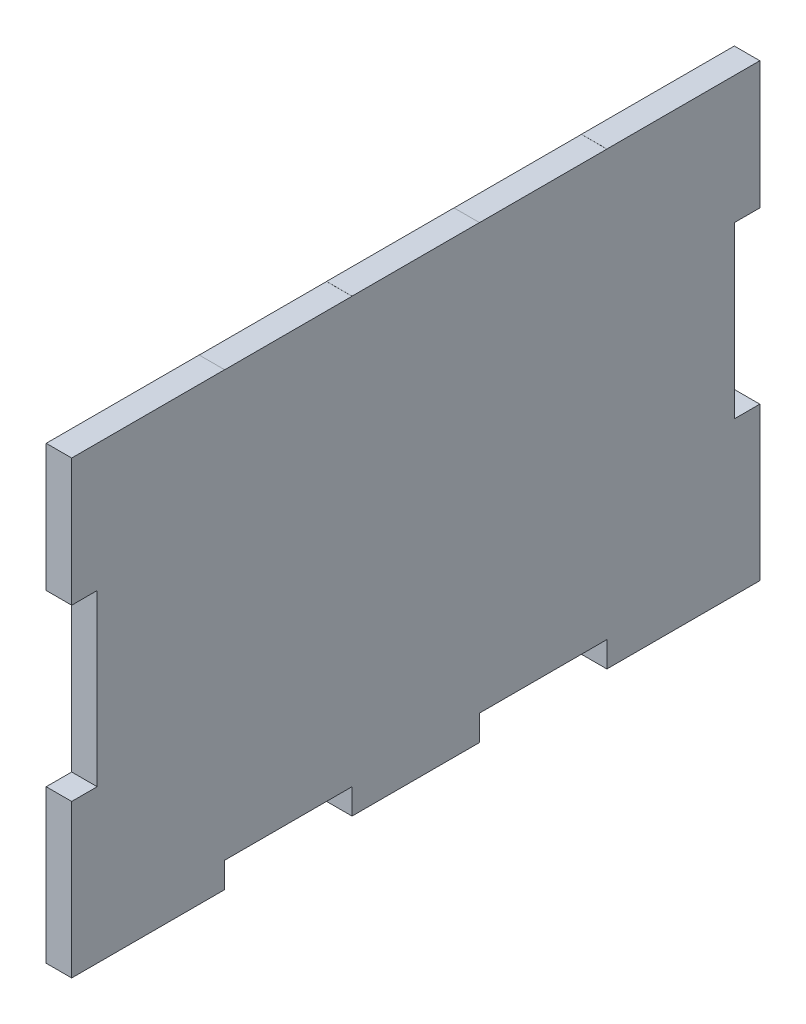
ISO-10303-21;
HEADER;
FILE_DESCRIPTION(('STEP AP214'),'2;1');
FILE_NAME('part.step','',(''),(''),'','','');
FILE_SCHEMA(('AUTOMOTIVE_DESIGN { 1 0 10303 214 1 1 1 1 }'));
ENDSEC;
DATA;
#1=APPLICATION_CONTEXT('core data for automotive mechanical design processes');
#2=APPLICATION_PROTOCOL_DEFINITION('international standard','automotive_design',2000,#1);
#3=PRODUCT_CONTEXT('',#1,'mechanical');
#4=PRODUCT('Part','Part','',(#3));
#5=PRODUCT_RELATED_PRODUCT_CATEGORY('part','',(#4));
#6=PRODUCT_DEFINITION_FORMATION('','',#4);
#7=PRODUCT_DEFINITION_CONTEXT('part definition',#1,'design');
#8=PRODUCT_DEFINITION('design','',#6,#7);
#9=PRODUCT_DEFINITION_SHAPE('','',#8);
#10=(LENGTH_UNIT() NAMED_UNIT(*) SI_UNIT(.MILLI.,.METRE.));
#11=(NAMED_UNIT(*) PLANE_ANGLE_UNIT() SI_UNIT($,.RADIAN.));
#12=(NAMED_UNIT(*) SI_UNIT($,.STERADIAN.) SOLID_ANGLE_UNIT());
#13=UNCERTAINTY_MEASURE_WITH_UNIT(LENGTH_MEASURE(1.E-05),#10,'distance_accuracy_value','');
#14=(GEOMETRIC_REPRESENTATION_CONTEXT(3) GLOBAL_UNCERTAINTY_ASSIGNED_CONTEXT((#13)) GLOBAL_UNIT_ASSIGNED_CONTEXT((#10,
#11,#12)) REPRESENTATION_CONTEXT('',''));
#15=CARTESIAN_POINT('',(0.,0.,0.));
#16=DIRECTION('',(0.,0.,1.));
#17=DIRECTION('',(1.,0.,0.));
#18=AXIS2_PLACEMENT_3D('',#15,#16,#17);
#19=CARTESIAN_POINT('',(6.,-50.,-75.));
#20=DIRECTION('',(0.,0.,1.));
#21=DIRECTION('',(1.,0.,0.));
#22=AXIS2_PLACEMENT_3D('',#19,#20,#21);
#23=PLANE('',#22);
#24=DIRECTION('',(-1.,0.,0.));
#25=VECTOR('',#24,1.);
#26=CARTESIAN_POINT('',(0.,20.,-75.));
#27=LINE('',#26,#25);
#28=CARTESIAN_POINT('',(6.,20.,-75.));
#29=VERTEX_POINT('',#28);
#30=CARTESIAN_POINT('',(0.,20.,-75.));
#31=VERTEX_POINT('',#30);
#32=EDGE_CURVE('E409',#29,#31,#27,.T.);
#33=ORIENTED_EDGE('',*,*,#32,.F.);
#34=DIRECTION('',(0.,1.,0.));
#35=VECTOR('',#34,1.);
#36=CARTESIAN_POINT('',(6.,-50.,-75.));
#37=LINE('',#36,#35);
#38=CARTESIAN_POINT('',(6.,-20.,-75.));
#39=VERTEX_POINT('',#38);
#40=EDGE_CURVE('E353',#39,#29,#37,.T.);
#41=ORIENTED_EDGE('',*,*,#40,.F.);
#42=DIRECTION('',(1.,0.,0.));
#43=VECTOR('',#42,1.);
#44=CARTESIAN_POINT('',(6.,-20.,-75.));
#45=LINE('',#44,#43);
#46=CARTESIAN_POINT('',(0.,-20.,-75.));
#47=VERTEX_POINT('',#46);
#48=EDGE_CURVE('E421',#47,#39,#45,.T.);
#49=ORIENTED_EDGE('',*,*,#48,.F.);
#50=DIRECTION('',(0.,1.,0.));
#51=VECTOR('',#50,1.);
#52=CARTESIAN_POINT('',(0.,-50.,-75.));
#53=LINE('',#52,#51);
#54=EDGE_CURVE('E360',#47,#31,#53,.T.);
#55=ORIENTED_EDGE('',*,*,#54,.T.);
#56=EDGE_LOOP('',(#33,#41,#49,#55));
#57=FACE_BOUND('',#56,.T.);
#58=ADVANCED_FACE('F37',(#57),#23,.F.);
#59=CARTESIAN_POINT('',(6.,-50.,75.));
#60=DIRECTION('',(0.,0.,-1.));
#61=DIRECTION('',(0.,1.,0.));
#62=AXIS2_PLACEMENT_3D('',#59,#60,#61);
#63=PLANE('',#62);
#64=DIRECTION('',(-1.,0.,0.));
#65=VECTOR('',#64,1.);
#66=CARTESIAN_POINT('',(0.,-20.,75.));
#67=LINE('',#66,#65);
#68=CARTESIAN_POINT('',(6.,-20.,75.));
#69=VERTEX_POINT('',#68);
#70=CARTESIAN_POINT('',(0.,-20.,75.));
#71=VERTEX_POINT('',#70);
#72=EDGE_CURVE('E440',#69,#71,#67,.T.);
#73=ORIENTED_EDGE('',*,*,#72,.F.);
#74=DIRECTION('',(0.,-1.,0.));
#75=VECTOR('',#74,1.);
#76=CARTESIAN_POINT('',(6.,-50.,75.));
#77=LINE('',#76,#75);
#78=CARTESIAN_POINT('',(6.,20.,75.));
#79=VERTEX_POINT('',#78);
#80=EDGE_CURVE('E346',#79,#69,#77,.T.);
#81=ORIENTED_EDGE('',*,*,#80,.F.);
#82=DIRECTION('',(1.,0.,0.));
#83=VECTOR('',#82,1.);
#84=CARTESIAN_POINT('',(0.,20.,75.));
#85=LINE('',#84,#83);
#86=CARTESIAN_POINT('',(0.,20.,75.));
#87=VERTEX_POINT('',#86);
#88=EDGE_CURVE('E255',#87,#79,#85,.T.);
#89=ORIENTED_EDGE('',*,*,#88,.F.);
#90=DIRECTION('',(0.,-1.,0.));
#91=VECTOR('',#90,1.);
#92=CARTESIAN_POINT('',(0.,-50.,75.));
#93=LINE('',#92,#91);
#94=EDGE_CURVE('E345',#87,#71,#93,.T.);
#95=ORIENTED_EDGE('',*,*,#94,.T.);
#96=EDGE_LOOP('',(#73,#81,#89,#95));
#97=FACE_BOUND('',#96,.T.);
#98=ADVANCED_FACE('F39',(#97),#63,.F.);
#99=CARTESIAN_POINT('',(6.,-50.,-75.));
#100=DIRECTION('',(0.,1.,0.));
#101=DIRECTION('',(0.,0.,1.));
#102=AXIS2_PLACEMENT_3D('',#99,#100,#101);
#103=PLANE('',#102);
#104=DIRECTION('',(-1.,0.,0.));
#105=VECTOR('',#104,1.);
#106=CARTESIAN_POINT('',(0.,-50.,-45.));
#107=LINE('',#106,#105);
#108=CARTESIAN_POINT('',(6.,-50.,-45.));
#109=VERTEX_POINT('',#108);
#110=CARTESIAN_POINT('',(0.,-50.,-45.));
#111=VERTEX_POINT('',#110);
#112=EDGE_CURVE('E261',#109,#111,#107,.T.);
#113=ORIENTED_EDGE('',*,*,#112,.F.);
#114=DIRECTION('',(0.,0.,-1.));
#115=VECTOR('',#114,1.);
#116=CARTESIAN_POINT('',(6.,-50.,-75.));
#117=LINE('',#116,#115);
#118=CARTESIAN_POINT('',(6.,-50.,-15.));
#119=VERTEX_POINT('',#118);
#120=EDGE_CURVE('E349',#119,#109,#117,.T.);
#121=ORIENTED_EDGE('',*,*,#120,.F.);
#122=DIRECTION('',(1.,0.,0.));
#123=VECTOR('',#122,1.);
#124=CARTESIAN_POINT('',(0.,-50.,-15.));
#125=LINE('',#124,#123);
#126=CARTESIAN_POINT('',(0.,-50.,-15.));
#127=VERTEX_POINT('',#126);
#128=EDGE_CURVE('E276',#127,#119,#125,.T.);
#129=ORIENTED_EDGE('',*,*,#128,.F.);
#130=DIRECTION('',(0.,0.,-1.));
#131=VECTOR('',#130,1.);
#132=CARTESIAN_POINT('',(0.,-50.,-75.));
#133=LINE('',#132,#131);
#134=EDGE_CURVE('E358',#127,#111,#133,.T.);
#135=ORIENTED_EDGE('',*,*,#134,.T.);
#136=EDGE_LOOP('',(#113,#121,#129,#135));
#137=FACE_BOUND('',#136,.T.);
#138=ADVANCED_FACE('F498',(#137),#103,.F.);
#139=DIRECTION('',(-1.,0.,0.));
#140=VECTOR('',#139,1.);
#141=CARTESIAN_POINT('',(0.,-50.,15.));
#142=LINE('',#141,#140);
#143=CARTESIAN_POINT('',(6.,-50.,15.));
#144=VERTEX_POINT('',#143);
#145=CARTESIAN_POINT('',(0.,-50.,15.));
#146=VERTEX_POINT('',#145);
#147=EDGE_CURVE('E281',#144,#146,#142,.T.);
#148=ORIENTED_EDGE('',*,*,#147,.F.);
#149=CARTESIAN_POINT('',(6.,-50.,45.));
#150=VERTEX_POINT('',#149);
#151=EDGE_CURVE('E350',#150,#144,#117,.T.);
#152=ORIENTED_EDGE('',*,*,#151,.F.);
#153=DIRECTION('',(1.,0.,0.));
#154=VECTOR('',#153,1.);
#155=CARTESIAN_POINT('',(6.,-50.,45.));
#156=LINE('',#155,#154);
#157=CARTESIAN_POINT('',(0.,-50.,45.));
#158=VERTEX_POINT('',#157);
#159=EDGE_CURVE('E303',#158,#150,#156,.T.);
#160=ORIENTED_EDGE('',*,*,#159,.F.);
#161=EDGE_CURVE('E359',#158,#146,#133,.T.);
#162=ORIENTED_EDGE('',*,*,#161,.T.);
#163=EDGE_LOOP('',(#148,#152,#160,#162));
#164=FACE_BOUND('',#163,.T.);
#165=ADVANCED_FACE('F482',(#164),#103,.F.);
#166=CARTESIAN_POINT('',(6.,50.,-75.));
#167=DIRECTION('',(0.,-1.,0.));
#168=DIRECTION('',(0.,0.,-1.));
#169=AXIS2_PLACEMENT_3D('',#166,#167,#168);
#170=PLANE('',#169);
#171=DIRECTION('',(-1.,0.,0.));
#172=VECTOR('',#171,1.);
#173=CARTESIAN_POINT('',(0.,50.,45.));
#174=LINE('',#173,#172);
#175=CARTESIAN_POINT('',(6.,50.,45.));
#176=VERTEX_POINT('',#175);
#177=CARTESIAN_POINT('',(0.,50.,45.));
#178=VERTEX_POINT('',#177);
#179=EDGE_CURVE('E318',#176,#178,#174,.T.);
#180=ORIENTED_EDGE('',*,*,#179,.F.);
#181=DIRECTION('',(0.,0.,1.));
#182=VECTOR('',#181,1.);
#183=CARTESIAN_POINT('',(6.,50.,-75.));
#184=LINE('',#183,#182);
#185=CARTESIAN_POINT('',(6.,50.,15.));
#186=VERTEX_POINT('',#185);
#187=EDGE_CURVE('E46',#186,#176,#184,.T.);
#188=ORIENTED_EDGE('',*,*,#187,.F.);
#189=DIRECTION('',(1.,0.,0.));
#190=VECTOR('',#189,1.);
#191=CARTESIAN_POINT('',(0.,50.,15.));
#192=LINE('',#191,#190);
#193=CARTESIAN_POINT('',(0.,50.,15.));
#194=VERTEX_POINT('',#193);
#195=EDGE_CURVE('E324',#194,#186,#192,.T.);
#196=ORIENTED_EDGE('',*,*,#195,.F.);
#197=DIRECTION('',(0.,0.,1.));
#198=VECTOR('',#197,1.);
#199=CARTESIAN_POINT('',(0.,50.,-75.));
#200=LINE('',#199,#198);
#201=EDGE_CURVE('E362',#194,#178,#200,.T.);
#202=ORIENTED_EDGE('',*,*,#201,.T.);
#203=EDGE_LOOP('',(#180,#188,#196,#202));
#204=FACE_BOUND('',#203,.T.);
#205=ADVANCED_FACE('F531',(#204),#170,.F.);
#206=DIRECTION('',(-1.,0.,0.));
#207=VECTOR('',#206,1.);
#208=CARTESIAN_POINT('',(0.,50.,-15.));
#209=LINE('',#208,#207);
#210=CARTESIAN_POINT('',(6.,50.,-15.));
#211=VERTEX_POINT('',#210);
#212=CARTESIAN_POINT('',(0.,50.,-15.));
#213=VERTEX_POINT('',#212);
#214=EDGE_CURVE('E327',#211,#213,#209,.T.);
#215=ORIENTED_EDGE('',*,*,#214,.F.);
#216=CARTESIAN_POINT('',(6.,50.,-45.));
#217=VERTEX_POINT('',#216);
#218=EDGE_CURVE('E11',#217,#211,#184,.T.);
#219=ORIENTED_EDGE('',*,*,#218,.F.);
#220=DIRECTION('',(1.,0.,0.));
#221=VECTOR('',#220,1.);
#222=CARTESIAN_POINT('',(6.,50.,-45.));
#223=LINE('',#222,#221);
#224=CARTESIAN_POINT('',(0.,50.,-45.));
#225=VERTEX_POINT('',#224);
#226=EDGE_CURVE('E338',#225,#217,#223,.T.);
#227=ORIENTED_EDGE('',*,*,#226,.F.);
#228=EDGE_CURVE('E41',#225,#213,#200,.T.);
#229=ORIENTED_EDGE('',*,*,#228,.T.);
#230=EDGE_LOOP('',(#215,#219,#227,#229));
#231=FACE_BOUND('',#230,.T.);
#232=ADVANCED_FACE('F376',(#231),#170,.F.);
#233=CARTESIAN_POINT('',(6.,0.,0.));
#234=DIRECTION('',(1.,0.,0.));
#235=DIRECTION('',(0.,0.,-1.));
#236=AXIS2_PLACEMENT_3D('',#233,#234,#235);
#237=PLANE('',#236);
#238=DIRECTION('',(0.,0.,1.));
#239=VECTOR('',#238,1.);
#240=CARTESIAN_POINT('',(6.,50.0175290238168,-81.));
#241=LINE('',#240,#239);
#242=CARTESIAN_POINT('',(6.,50.0175290238168,45.));
#243=VERTEX_POINT('',#242);
#244=CARTESIAN_POINT('',(6.,50.0175290238168,81.));
#245=VERTEX_POINT('',#244);
#246=EDGE_CURVE('E224',#243,#245,#241,.T.);
#247=ORIENTED_EDGE('',*,*,#246,.T.);
#248=DIRECTION('',(0.,1.,0.));
#249=VECTOR('',#248,1.);
#250=CARTESIAN_POINT('',(6.,56.,81.));
#251=LINE('',#250,#249);
#252=CARTESIAN_POINT('',(6.,20.,81.));
#253=VERTEX_POINT('',#252);
#254=EDGE_CURVE('E237',#253,#245,#251,.T.);
#255=ORIENTED_EDGE('',*,*,#254,.F.);
#256=DIRECTION('',(0.,0.,-1.));
#257=VECTOR('',#256,1.);
#258=CARTESIAN_POINT('',(6.,20.,81.));
#259=LINE('',#258,#257);
#260=EDGE_CURVE('E247',#253,#79,#259,.T.);
#261=ORIENTED_EDGE('',*,*,#260,.T.);
#262=ORIENTED_EDGE('',*,*,#80,.T.);
#263=DIRECTION('',(0.,0.,-1.));
#264=VECTOR('',#263,1.);
#265=CARTESIAN_POINT('',(6.,-20.,81.));
#266=LINE('',#265,#264);
#267=CARTESIAN_POINT('',(6.,-20.,81.));
#268=VERTEX_POINT('',#267);
#269=EDGE_CURVE('E257',#268,#69,#266,.T.);
#270=ORIENTED_EDGE('',*,*,#269,.F.);
#271=DIRECTION('',(0.,1.,0.));
#272=VECTOR('',#271,1.);
#273=CARTESIAN_POINT('',(6.,-56.,81.));
#274=LINE('',#273,#272);
#275=CARTESIAN_POINT('',(6.,-56.,81.));
#276=VERTEX_POINT('',#275);
#277=EDGE_CURVE('E447',#276,#268,#274,.T.);
#278=ORIENTED_EDGE('',*,*,#277,.F.);
#279=DIRECTION('',(0.,0.,1.));
#280=VECTOR('',#279,1.);
#281=CARTESIAN_POINT('',(6.,-56.,75.));
#282=LINE('',#281,#280);
#283=CARTESIAN_POINT('',(6.,-56.,45.));
#284=VERTEX_POINT('',#283);
#285=EDGE_CURVE('E304',#284,#276,#282,.T.);
#286=ORIENTED_EDGE('',*,*,#285,.F.);
#287=DIRECTION('',(0.,1.,0.));
#288=VECTOR('',#287,1.);
#289=CARTESIAN_POINT('',(6.,-56.,45.));
#290=LINE('',#289,#288);
#291=EDGE_CURVE('E310',#284,#150,#290,.T.);
#292=ORIENTED_EDGE('',*,*,#291,.T.);
#293=ORIENTED_EDGE('',*,*,#151,.T.);
#294=DIRECTION('',(0.,1.,0.));
#295=VECTOR('',#294,1.);
#296=CARTESIAN_POINT('',(6.,-56.,15.));
#297=LINE('',#296,#295);
#298=CARTESIAN_POINT('',(6.,-56.,15.));
#299=VERTEX_POINT('',#298);
#300=EDGE_CURVE('E294',#299,#144,#297,.T.);
#301=ORIENTED_EDGE('',*,*,#300,.F.);
#302=DIRECTION('',(0.,0.,1.));
#303=VECTOR('',#302,1.);
#304=CARTESIAN_POINT('',(6.,-56.,15.));
#305=LINE('',#304,#303);
#306=CARTESIAN_POINT('',(6.,-56.,-15.));
#307=VERTEX_POINT('',#306);
#308=EDGE_CURVE('E283',#307,#299,#305,.T.);
#309=ORIENTED_EDGE('',*,*,#308,.F.);
#310=DIRECTION('',(0.,1.,0.));
#311=VECTOR('',#310,1.);
#312=CARTESIAN_POINT('',(6.,-56.,-15.));
#313=LINE('',#312,#311);
#314=EDGE_CURVE('E297',#307,#119,#313,.T.);
#315=ORIENTED_EDGE('',*,*,#314,.T.);
#316=ORIENTED_EDGE('',*,*,#120,.T.);
#317=DIRECTION('',(0.,1.,0.));
#318=VECTOR('',#317,1.);
#319=CARTESIAN_POINT('',(6.,-56.,-45.));
#320=LINE('',#319,#318);
#321=CARTESIAN_POINT('',(6.,-56.,-45.));
#322=VERTEX_POINT('',#321);
#323=EDGE_CURVE('E273',#322,#109,#320,.T.);
#324=ORIENTED_EDGE('',*,*,#323,.F.);
#325=DIRECTION('',(0.,0.,1.));
#326=VECTOR('',#325,1.);
#327=CARTESIAN_POINT('',(6.,-56.,-75.));
#328=LINE('',#327,#326);
#329=CARTESIAN_POINT('',(6.,-56.,-81.));
#330=VERTEX_POINT('',#329);
#331=EDGE_CURVE('E264',#330,#322,#328,.T.);
#332=ORIENTED_EDGE('',*,*,#331,.F.);
#333=DIRECTION('',(0.,-1.,0.));
#334=VECTOR('',#333,1.);
#335=CARTESIAN_POINT('',(6.,-56.,-81.));
#336=LINE('',#335,#334);
#337=CARTESIAN_POINT('',(6.,-20.,-81.));
#338=VERTEX_POINT('',#337);
#339=EDGE_CURVE('E422',#338,#330,#336,.T.);
#340=ORIENTED_EDGE('',*,*,#339,.F.);
#341=DIRECTION('',(0.,0.,1.));
#342=VECTOR('',#341,1.);
#343=CARTESIAN_POINT('',(6.,-20.,-81.));
#344=LINE('',#343,#342);
#345=EDGE_CURVE('E432',#338,#39,#344,.T.);
#346=ORIENTED_EDGE('',*,*,#345,.T.);
#347=ORIENTED_EDGE('',*,*,#40,.T.);
#348=DIRECTION('',(0.,0.,1.));
#349=VECTOR('',#348,1.);
#350=CARTESIAN_POINT('',(6.,20.,-81.));
#351=LINE('',#350,#349);
#352=CARTESIAN_POINT('',(6.,20.,-81.));
#353=VERTEX_POINT('',#352);
#354=EDGE_CURVE('E419',#353,#29,#351,.T.);
#355=ORIENTED_EDGE('',*,*,#354,.F.);
#356=DIRECTION('',(0.,-1.,0.));
#357=VECTOR('',#356,1.);
#358=CARTESIAN_POINT('',(6.,56.,-81.));
#359=LINE('',#358,#357);
#360=CARTESIAN_POINT('',(6.,50.0175290238168,-81.));
#361=VERTEX_POINT('',#360);
#362=EDGE_CURVE('E408',#361,#353,#359,.T.);
#363=ORIENTED_EDGE('',*,*,#362,.F.);
#364=CARTESIAN_POINT('',(6.,50.0175290238168,-45.));
#365=VERTEX_POINT('',#364);
#366=EDGE_CURVE('E242',#361,#365,#241,.T.);
#367=ORIENTED_EDGE('',*,*,#366,.T.);
#368=DIRECTION('',(0.,-1.,0.));
#369=VECTOR('',#368,1.);
#370=CARTESIAN_POINT('',(6.,56.,-45.));
#371=LINE('',#370,#369);
#372=EDGE_CURVE('E341',#365,#217,#371,.T.);
#373=ORIENTED_EDGE('',*,*,#372,.T.);
#374=ORIENTED_EDGE('',*,*,#218,.T.);
#375=DIRECTION('',(0.,-1.,0.));
#376=VECTOR('',#375,1.);
#377=CARTESIAN_POINT('',(6.,56.,-15.));
#378=LINE('',#377,#376);
#379=CARTESIAN_POINT('',(6.,50.0175290238168,-15.));
#380=VERTEX_POINT('',#379);
#381=EDGE_CURVE('E332',#380,#211,#378,.T.);
#382=ORIENTED_EDGE('',*,*,#381,.F.);
#383=CARTESIAN_POINT('',(6.,50.0175290238168,15.));
#384=VERTEX_POINT('',#383);
#385=EDGE_CURVE('E54',#380,#384,#241,.T.);
#386=ORIENTED_EDGE('',*,*,#385,.T.);
#387=DIRECTION('',(0.,-1.,0.));
#388=VECTOR('',#387,1.);
#389=CARTESIAN_POINT('',(6.,56.,15.));
#390=LINE('',#389,#388);
#391=EDGE_CURVE('E334',#384,#186,#390,.T.);
#392=ORIENTED_EDGE('',*,*,#391,.T.);
#393=ORIENTED_EDGE('',*,*,#187,.T.);
#394=DIRECTION('',(0.,-1.,0.));
#395=VECTOR('',#394,1.);
#396=CARTESIAN_POINT('',(6.,56.,45.));
#397=LINE('',#396,#395);
#398=EDGE_CURVE('E239',#243,#176,#397,.T.);
#399=ORIENTED_EDGE('',*,*,#398,.F.);
#400=EDGE_LOOP('',(#247,#255,#261,#262,#270,#278,#286,#292,#293,#301,#309,#315,#316,#324,#332,
#340,#346,#347,#355,#363,#367,#373,#374,#382,#386,#392,#393,#399));
#401=FACE_BOUND('',#400,.T.);
#402=ADVANCED_FACE('F235',(#401),#237,.T.);
#403=CARTESIAN_POINT('',(0.,0.,0.));
#404=DIRECTION('',(1.,0.,0.));
#405=DIRECTION('',(0.,0.,-1.));
#406=AXIS2_PLACEMENT_3D('',#403,#404,#405);
#407=PLANE('',#406);
#408=DIRECTION('',(0.,-1.,0.));
#409=VECTOR('',#408,1.);
#410=CARTESIAN_POINT('',(0.,56.,81.));
#411=LINE('',#410,#409);
#412=CARTESIAN_POINT('',(0.,50.0175290238168,81.));
#413=VERTEX_POINT('',#412);
#414=CARTESIAN_POINT('',(0.,20.,81.));
#415=VERTEX_POINT('',#414);
#416=EDGE_CURVE('E251',#413,#415,#411,.T.);
#417=ORIENTED_EDGE('',*,*,#416,.F.);
#418=DIRECTION('',(0.,0.,1.));
#419=VECTOR('',#418,1.);
#420=CARTESIAN_POINT('',(0.,50.0175290238168,-81.));
#421=LINE('',#420,#419);
#422=CARTESIAN_POINT('',(0.,50.0175290238168,45.));
#423=VERTEX_POINT('',#422);
#424=EDGE_CURVE('E62',#423,#413,#421,.T.);
#425=ORIENTED_EDGE('',*,*,#424,.F.);
#426=DIRECTION('',(0.,-1.,0.));
#427=VECTOR('',#426,1.);
#428=CARTESIAN_POINT('',(0.,56.,45.));
#429=LINE('',#428,#427);
#430=EDGE_CURVE('E321',#423,#178,#429,.T.);
#431=ORIENTED_EDGE('',*,*,#430,.T.);
#432=ORIENTED_EDGE('',*,*,#201,.F.);
#433=DIRECTION('',(0.,-1.,0.));
#434=VECTOR('',#433,1.);
#435=CARTESIAN_POINT('',(0.,56.,15.));
#436=LINE('',#435,#434);
#437=CARTESIAN_POINT('',(0.,50.0175290238168,15.));
#438=VERTEX_POINT('',#437);
#439=EDGE_CURVE('E336',#438,#194,#436,.T.);
#440=ORIENTED_EDGE('',*,*,#439,.F.);
#441=CARTESIAN_POINT('',(0.,50.0175290238168,-15.));
#442=VERTEX_POINT('',#441);
#443=EDGE_CURVE('E399',#442,#438,#421,.T.);
#444=ORIENTED_EDGE('',*,*,#443,.F.);
#445=DIRECTION('',(0.,-1.,0.));
#446=VECTOR('',#445,1.);
#447=CARTESIAN_POINT('',(0.,56.,-15.));
#448=LINE('',#447,#446);
#449=EDGE_CURVE('E330',#442,#213,#448,.T.);
#450=ORIENTED_EDGE('',*,*,#449,.T.);
#451=ORIENTED_EDGE('',*,*,#228,.F.);
#452=DIRECTION('',(0.,-1.,0.));
#453=VECTOR('',#452,1.);
#454=CARTESIAN_POINT('',(0.,56.,-45.));
#455=LINE('',#454,#453);
#456=CARTESIAN_POINT('',(0.,50.0175290238168,-45.));
#457=VERTEX_POINT('',#456);
#458=EDGE_CURVE('E343',#457,#225,#455,.T.);
#459=ORIENTED_EDGE('',*,*,#458,.F.);
#460=CARTESIAN_POINT('',(0.,50.0175290238168,-81.));
#461=VERTEX_POINT('',#460);
#462=EDGE_CURVE('E240',#461,#457,#421,.T.);
#463=ORIENTED_EDGE('',*,*,#462,.F.);
#464=DIRECTION('',(0.,1.,0.));
#465=VECTOR('',#464,1.);
#466=CARTESIAN_POINT('',(0.,56.,-81.));
#467=LINE('',#466,#465);
#468=CARTESIAN_POINT('',(0.,20.,-81.));
#469=VERTEX_POINT('',#468);
#470=EDGE_CURVE('E397',#469,#461,#467,.T.);
#471=ORIENTED_EDGE('',*,*,#470,.F.);
#472=DIRECTION('',(0.,0.,1.));
#473=VECTOR('',#472,1.);
#474=CARTESIAN_POINT('',(0.,20.,-81.));
#475=LINE('',#474,#473);
#476=EDGE_CURVE('E416',#469,#31,#475,.T.);
#477=ORIENTED_EDGE('',*,*,#476,.T.);
#478=ORIENTED_EDGE('',*,*,#54,.F.);
#479=DIRECTION('',(0.,0.,1.));
#480=VECTOR('',#479,1.);
#481=CARTESIAN_POINT('',(0.,-20.,-81.));
#482=LINE('',#481,#480);
#483=CARTESIAN_POINT('',(0.,-20.,-81.));
#484=VERTEX_POINT('',#483);
#485=EDGE_CURVE('E437',#484,#47,#482,.T.);
#486=ORIENTED_EDGE('',*,*,#485,.F.);
#487=DIRECTION('',(0.,1.,0.));
#488=VECTOR('',#487,1.);
#489=CARTESIAN_POINT('',(0.,-56.,-81.));
#490=LINE('',#489,#488);
#491=CARTESIAN_POINT('',(0.,-56.,-81.));
#492=VERTEX_POINT('',#491);
#493=EDGE_CURVE('E428',#492,#484,#490,.T.);
#494=ORIENTED_EDGE('',*,*,#493,.F.);
#495=DIRECTION('',(0.,0.,-1.));
#496=VECTOR('',#495,1.);
#497=CARTESIAN_POINT('',(0.,-56.,-75.));
#498=LINE('',#497,#496);
#499=CARTESIAN_POINT('',(0.,-56.,-45.));
#500=VERTEX_POINT('',#499);
#501=EDGE_CURVE('E262',#500,#492,#498,.T.);
#502=ORIENTED_EDGE('',*,*,#501,.F.);
#503=DIRECTION('',(0.,1.,0.));
#504=VECTOR('',#503,1.);
#505=CARTESIAN_POINT('',(0.,-56.,-45.));
#506=LINE('',#505,#504);
#507=EDGE_CURVE('E268',#500,#111,#506,.T.);
#508=ORIENTED_EDGE('',*,*,#507,.T.);
#509=ORIENTED_EDGE('',*,*,#134,.F.);
#510=DIRECTION('',(0.,1.,0.));
#511=VECTOR('',#510,1.);
#512=CARTESIAN_POINT('',(0.,-56.,-15.));
#513=LINE('',#512,#511);
#514=CARTESIAN_POINT('',(0.,-56.,-15.));
#515=VERTEX_POINT('',#514);
#516=EDGE_CURVE('E300',#515,#127,#513,.T.);
#517=ORIENTED_EDGE('',*,*,#516,.F.);
#518=DIRECTION('',(0.,0.,-1.));
#519=VECTOR('',#518,1.);
#520=CARTESIAN_POINT('',(0.,-56.,15.));
#521=LINE('',#520,#519);
#522=CARTESIAN_POINT('',(0.,-56.,15.));
#523=VERTEX_POINT('',#522);
#524=EDGE_CURVE('E277',#523,#515,#521,.T.);
#525=ORIENTED_EDGE('',*,*,#524,.F.);
#526=DIRECTION('',(0.,1.,0.));
#527=VECTOR('',#526,1.);
#528=CARTESIAN_POINT('',(0.,-56.,15.));
#529=LINE('',#528,#527);
#530=EDGE_CURVE('E287',#523,#146,#529,.T.);
#531=ORIENTED_EDGE('',*,*,#530,.T.);
#532=ORIENTED_EDGE('',*,*,#161,.F.);
#533=DIRECTION('',(0.,1.,0.));
#534=VECTOR('',#533,1.);
#535=CARTESIAN_POINT('',(0.,-56.,45.));
#536=LINE('',#535,#534);
#537=CARTESIAN_POINT('',(0.,-56.,45.));
#538=VERTEX_POINT('',#537);
#539=EDGE_CURVE('E315',#538,#158,#536,.T.);
#540=ORIENTED_EDGE('',*,*,#539,.F.);
#541=DIRECTION('',(0.,0.,-1.));
#542=VECTOR('',#541,1.);
#543=CARTESIAN_POINT('',(0.,-56.,75.));
#544=LINE('',#543,#542);
#545=CARTESIAN_POINT('',(0.,-56.,81.));
#546=VERTEX_POINT('',#545);
#547=EDGE_CURVE('E306',#546,#538,#544,.T.);
#548=ORIENTED_EDGE('',*,*,#547,.F.);
#549=DIRECTION('',(0.,-1.,0.));
#550=VECTOR('',#549,1.);
#551=CARTESIAN_POINT('',(0.,-56.,81.));
#552=LINE('',#551,#550);
#553=CARTESIAN_POINT('',(0.,-20.,81.));
#554=VERTEX_POINT('',#553);
#555=EDGE_CURVE('E441',#554,#546,#552,.T.);
#556=ORIENTED_EDGE('',*,*,#555,.F.);
#557=DIRECTION('',(0.,0.,-1.));
#558=VECTOR('',#557,1.);
#559=CARTESIAN_POINT('',(0.,-20.,81.));
#560=LINE('',#559,#558);
#561=EDGE_CURVE('E451',#554,#71,#560,.T.);
#562=ORIENTED_EDGE('',*,*,#561,.T.);
#563=ORIENTED_EDGE('',*,*,#94,.F.);
#564=DIRECTION('',(0.,0.,-1.));
#565=VECTOR('',#564,1.);
#566=CARTESIAN_POINT('',(0.,20.,81.));
#567=LINE('',#566,#565);
#568=EDGE_CURVE('E249',#415,#87,#567,.T.);
#569=ORIENTED_EDGE('',*,*,#568,.F.);
#570=EDGE_LOOP('',(#417,#425,#431,#432,#440,#444,#450,#451,#459,#463,#471,#477,#478,#486,#494,
#502,#508,#509,#517,#525,#531,#532,#540,#548,#556,#562,#563,#569));
#571=FACE_BOUND('',#570,.T.);
#572=ADVANCED_FACE('F393',(#571),#407,.F.);
#573=CARTESIAN_POINT('',(6.,56.,-45.));
#574=DIRECTION('',(0.,0.,-1.));
#575=DIRECTION('',(0.,1.,0.));
#576=AXIS2_PLACEMENT_3D('',#573,#574,#575);
#577=PLANE('',#576);
#578=ORIENTED_EDGE('',*,*,#372,.F.);
#579=DIRECTION('',(-1.,0.,0.));
#580=VECTOR('',#579,1.);
#581=CARTESIAN_POINT('',(6.,50.0175290238168,-45.));
#582=LINE('',#581,#580);
#583=EDGE_CURVE('E391',#365,#457,#582,.T.);
#584=ORIENTED_EDGE('',*,*,#583,.T.);
#585=ORIENTED_EDGE('',*,*,#458,.T.);
#586=ORIENTED_EDGE('',*,*,#226,.T.);
#587=EDGE_LOOP('',(#578,#584,#585,#586));
#588=FACE_BOUND('',#587,.T.);
#589=ADVANCED_FACE('F389',(#588),#577,.F.);
#590=CARTESIAN_POINT('',(0.,56.,15.));
#591=DIRECTION('',(0.,0.,-1.));
#592=DIRECTION('',(0.,1.,0.));
#593=AXIS2_PLACEMENT_3D('',#590,#591,#592);
#594=PLANE('',#593);
#595=ORIENTED_EDGE('',*,*,#391,.F.);
#596=DIRECTION('',(-1.,0.,0.));
#597=VECTOR('',#596,1.);
#598=CARTESIAN_POINT('',(0.,50.0175290238168,15.));
#599=LINE('',#598,#597);
#600=EDGE_CURVE('E523',#384,#438,#599,.T.);
#601=ORIENTED_EDGE('',*,*,#600,.T.);
#602=ORIENTED_EDGE('',*,*,#439,.T.);
#603=ORIENTED_EDGE('',*,*,#195,.T.);
#604=EDGE_LOOP('',(#595,#601,#602,#603));
#605=FACE_BOUND('',#604,.T.);
#606=ADVANCED_FACE('F527',(#605),#594,.F.);
#607=CARTESIAN_POINT('',(0.,56.,-15.));
#608=DIRECTION('',(0.,0.,1.));
#609=DIRECTION('',(0.,-1.,0.));
#610=AXIS2_PLACEMENT_3D('',#607,#608,#609);
#611=PLANE('',#610);
#612=ORIENTED_EDGE('',*,*,#449,.F.);
#613=DIRECTION('',(1.,0.,0.));
#614=VECTOR('',#613,1.);
#615=CARTESIAN_POINT('',(0.,50.0175290238168,-15.));
#616=LINE('',#615,#614);
#617=EDGE_CURVE('E384',#442,#380,#616,.T.);
#618=ORIENTED_EDGE('',*,*,#617,.T.);
#619=ORIENTED_EDGE('',*,*,#381,.T.);
#620=ORIENTED_EDGE('',*,*,#214,.T.);
#621=EDGE_LOOP('',(#612,#618,#619,#620));
#622=FACE_BOUND('',#621,.T.);
#623=ADVANCED_FACE('F382',(#622),#611,.F.);
#624=CARTESIAN_POINT('',(0.,56.,45.));
#625=DIRECTION('',(0.,0.,1.));
#626=DIRECTION('',(0.,-1.,0.));
#627=AXIS2_PLACEMENT_3D('',#624,#625,#626);
#628=PLANE('',#627);
#629=ORIENTED_EDGE('',*,*,#430,.F.);
#630=DIRECTION('',(1.,0.,0.));
#631=VECTOR('',#630,1.);
#632=CARTESIAN_POINT('',(0.,50.0175290238168,45.));
#633=LINE('',#632,#631);
#634=EDGE_CURVE('E229',#423,#243,#633,.T.);
#635=ORIENTED_EDGE('',*,*,#634,.T.);
#636=ORIENTED_EDGE('',*,*,#398,.T.);
#637=ORIENTED_EDGE('',*,*,#179,.T.);
#638=EDGE_LOOP('',(#629,#635,#636,#637));
#639=FACE_BOUND('',#638,.T.);
#640=ADVANCED_FACE('F533',(#639),#628,.F.);
#641=CARTESIAN_POINT('',(6.,-56.,45.));
#642=DIRECTION('',(0.,0.,1.));
#643=DIRECTION('',(0.,-1.,0.));
#644=AXIS2_PLACEMENT_3D('',#641,#642,#643);
#645=PLANE('',#644);
#646=ORIENTED_EDGE('',*,*,#159,.T.);
#647=ORIENTED_EDGE('',*,*,#291,.F.);
#648=DIRECTION('',(1.,0.,0.));
#649=VECTOR('',#648,1.);
#650=CARTESIAN_POINT('',(6.,-56.,45.));
#651=LINE('',#650,#649);
#652=EDGE_CURVE('E308',#538,#284,#651,.T.);
#653=ORIENTED_EDGE('',*,*,#652,.F.);
#654=ORIENTED_EDGE('',*,*,#539,.T.);
#655=EDGE_LOOP('',(#646,#647,#653,#654));
#656=FACE_BOUND('',#655,.T.);
#657=ADVANCED_FACE('F479',(#656),#645,.F.);
#658=CARTESIAN_POINT('',(0.,-56.,0.));
#659=DIRECTION('',(0.,1.,0.));
#660=DIRECTION('',(0.,0.,1.));
#661=AXIS2_PLACEMENT_3D('',#658,#659,#660);
#662=PLANE('',#661);
#663=ORIENTED_EDGE('',*,*,#285,.T.);
#664=DIRECTION('',(1.,0.,0.));
#665=VECTOR('',#664,1.);
#666=CARTESIAN_POINT('',(0.,-56.,81.));
#667=LINE('',#666,#665);
#668=EDGE_CURVE('E444',#546,#276,#667,.T.);
#669=ORIENTED_EDGE('',*,*,#668,.F.);
#670=ORIENTED_EDGE('',*,*,#547,.T.);
#671=ORIENTED_EDGE('',*,*,#652,.T.);
#672=EDGE_LOOP('',(#663,#669,#670,#671));
#673=FACE_BOUND('',#672,.T.);
#674=ADVANCED_FACE('F473',(#673),#662,.F.);
#675=CARTESIAN_POINT('',(0.,-56.,-15.));
#676=DIRECTION('',(0.,0.,1.));
#677=DIRECTION('',(0.,-1.,0.));
#678=AXIS2_PLACEMENT_3D('',#675,#676,#677);
#679=PLANE('',#678);
#680=ORIENTED_EDGE('',*,*,#128,.T.);
#681=ORIENTED_EDGE('',*,*,#314,.F.);
#682=DIRECTION('',(1.,0.,0.));
#683=VECTOR('',#682,1.);
#684=CARTESIAN_POINT('',(0.,-56.,-15.));
#685=LINE('',#684,#683);
#686=EDGE_CURVE('E280',#515,#307,#685,.T.);
#687=ORIENTED_EDGE('',*,*,#686,.F.);
#688=ORIENTED_EDGE('',*,*,#516,.T.);
#689=EDGE_LOOP('',(#680,#681,#687,#688));
#690=FACE_BOUND('',#689,.T.);
#691=ADVANCED_FACE('F495',(#690),#679,.F.);
#692=CARTESIAN_POINT('',(0.,-56.,15.));
#693=DIRECTION('',(0.,0.,-1.));
#694=DIRECTION('',(0.,1.,0.));
#695=AXIS2_PLACEMENT_3D('',#692,#693,#694);
#696=PLANE('',#695);
#697=ORIENTED_EDGE('',*,*,#147,.T.);
#698=ORIENTED_EDGE('',*,*,#530,.F.);
#699=DIRECTION('',(-1.,0.,0.));
#700=VECTOR('',#699,1.);
#701=CARTESIAN_POINT('',(0.,-56.,15.));
#702=LINE('',#701,#700);
#703=EDGE_CURVE('E285',#299,#523,#702,.T.);
#704=ORIENTED_EDGE('',*,*,#703,.F.);
#705=ORIENTED_EDGE('',*,*,#300,.T.);
#706=EDGE_LOOP('',(#697,#698,#704,#705));
#707=FACE_BOUND('',#706,.T.);
#708=ADVANCED_FACE('F488',(#707),#696,.F.);
#709=CARTESIAN_POINT('',(0.,-56.,0.));
#710=DIRECTION('',(0.,-1.,0.));
#711=DIRECTION('',(0.,0.,-1.));
#712=AXIS2_PLACEMENT_3D('',#709,#710,#711);
#713=PLANE('',#712);
#714=ORIENTED_EDGE('',*,*,#524,.T.);
#715=ORIENTED_EDGE('',*,*,#686,.T.);
#716=ORIENTED_EDGE('',*,*,#308,.T.);
#717=ORIENTED_EDGE('',*,*,#703,.T.);
#718=EDGE_LOOP('',(#714,#715,#716,#717));
#719=FACE_BOUND('',#718,.T.);
#720=ADVANCED_FACE('F493',(#719),#713,.T.);
#721=CARTESIAN_POINT('',(0.,-56.,-45.));
#722=DIRECTION('',(0.,0.,-1.));
#723=DIRECTION('',(0.,1.,0.));
#724=AXIS2_PLACEMENT_3D('',#721,#722,#723);
#725=PLANE('',#724);
#726=ORIENTED_EDGE('',*,*,#112,.T.);
#727=ORIENTED_EDGE('',*,*,#507,.F.);
#728=DIRECTION('',(-1.,0.,0.));
#729=VECTOR('',#728,1.);
#730=CARTESIAN_POINT('',(0.,-56.,-45.));
#731=LINE('',#730,#729);
#732=EDGE_CURVE('E266',#322,#500,#731,.T.);
#733=ORIENTED_EDGE('',*,*,#732,.F.);
#734=ORIENTED_EDGE('',*,*,#323,.T.);
#735=EDGE_LOOP('',(#726,#727,#733,#734));
#736=FACE_BOUND('',#735,.T.);
#737=ADVANCED_FACE('F502',(#736),#725,.F.);
#738=CARTESIAN_POINT('',(0.,-56.,0.));
#739=DIRECTION('',(0.,1.,0.));
#740=DIRECTION('',(0.,0.,1.));
#741=AXIS2_PLACEMENT_3D('',#738,#739,#740);
#742=PLANE('',#741);
#743=ORIENTED_EDGE('',*,*,#501,.T.);
#744=DIRECTION('',(-1.,0.,0.));
#745=VECTOR('',#744,1.);
#746=CARTESIAN_POINT('',(6.,-56.,-81.));
#747=LINE('',#746,#745);
#748=EDGE_CURVE('E425',#330,#492,#747,.T.);
#749=ORIENTED_EDGE('',*,*,#748,.F.);
#750=ORIENTED_EDGE('',*,*,#331,.T.);
#751=ORIENTED_EDGE('',*,*,#732,.T.);
#752=EDGE_LOOP('',(#743,#749,#750,#751));
#753=FACE_BOUND('',#752,.T.);
#754=ADVANCED_FACE('F506',(#753),#742,.F.);
#755=CARTESIAN_POINT('',(0.,20.,81.));
#756=DIRECTION('',(0.,1.,0.));
#757=DIRECTION('',(0.,0.,1.));
#758=AXIS2_PLACEMENT_3D('',#755,#756,#757);
#759=PLANE('',#758);
#760=ORIENTED_EDGE('',*,*,#88,.T.);
#761=ORIENTED_EDGE('',*,*,#260,.F.);
#762=DIRECTION('',(1.,0.,0.));
#763=VECTOR('',#762,1.);
#764=CARTESIAN_POINT('',(0.,20.,81.));
#765=LINE('',#764,#763);
#766=EDGE_CURVE('E245',#415,#253,#765,.T.);
#767=ORIENTED_EDGE('',*,*,#766,.F.);
#768=ORIENTED_EDGE('',*,*,#568,.T.);
#769=EDGE_LOOP('',(#760,#761,#767,#768));
#770=FACE_BOUND('',#769,.T.);
#771=ADVANCED_FACE('F457',(#770),#759,.F.);
#772=CARTESIAN_POINT('',(0.,0.,81.));
#773=DIRECTION('',(0.,0.,1.));
#774=DIRECTION('',(1.,0.,0.));
#775=AXIS2_PLACEMENT_3D('',#772,#773,#774);
#776=PLANE('',#775);
#777=DIRECTION('',(-1.,0.,0.));
#778=VECTOR('',#777,1.);
#779=CARTESIAN_POINT('',(6.,50.0175290238168,81.));
#780=LINE('',#779,#778);
#781=EDGE_CURVE('E221',#245,#413,#780,.T.);
#782=ORIENTED_EDGE('',*,*,#781,.T.);
#783=ORIENTED_EDGE('',*,*,#416,.T.);
#784=ORIENTED_EDGE('',*,*,#766,.T.);
#785=ORIENTED_EDGE('',*,*,#254,.T.);
#786=EDGE_LOOP('',(#782,#783,#784,#785));
#787=FACE_BOUND('',#786,.T.);
#788=ADVANCED_FACE('F243',(#787),#776,.T.);
#789=CARTESIAN_POINT('',(0.,-20.,81.));
#790=DIRECTION('',(0.,-1.,0.));
#791=DIRECTION('',(1.,0.,0.));
#792=AXIS2_PLACEMENT_3D('',#789,#790,#791);
#793=PLANE('',#792);
#794=ORIENTED_EDGE('',*,*,#72,.T.);
#795=ORIENTED_EDGE('',*,*,#561,.F.);
#796=DIRECTION('',(-1.,0.,0.));
#797=VECTOR('',#796,1.);
#798=CARTESIAN_POINT('',(0.,-20.,81.));
#799=LINE('',#798,#797);
#800=EDGE_CURVE('E449',#268,#554,#799,.T.);
#801=ORIENTED_EDGE('',*,*,#800,.F.);
#802=ORIENTED_EDGE('',*,*,#269,.T.);
#803=EDGE_LOOP('',(#794,#795,#801,#802));
#804=FACE_BOUND('',#803,.T.);
#805=ADVANCED_FACE('F468',(#804),#793,.F.);
#806=CARTESIAN_POINT('',(0.,0.,81.));
#807=DIRECTION('',(0.,0.,-1.));
#808=DIRECTION('',(-1.,0.,0.));
#809=AXIS2_PLACEMENT_3D('',#806,#807,#808);
#810=PLANE('',#809);
#811=ORIENTED_EDGE('',*,*,#555,.T.);
#812=ORIENTED_EDGE('',*,*,#668,.T.);
#813=ORIENTED_EDGE('',*,*,#277,.T.);
#814=ORIENTED_EDGE('',*,*,#800,.T.);
#815=EDGE_LOOP('',(#811,#812,#813,#814));
#816=FACE_BOUND('',#815,.T.);
#817=ADVANCED_FACE('F470',(#816),#810,.F.);
#818=CARTESIAN_POINT('',(6.,-20.,-81.));
#819=DIRECTION('',(0.,-1.,0.));
#820=DIRECTION('',(0.,0.,-1.));
#821=AXIS2_PLACEMENT_3D('',#818,#819,#820);
#822=PLANE('',#821);
#823=ORIENTED_EDGE('',*,*,#48,.T.);
#824=ORIENTED_EDGE('',*,*,#345,.F.);
#825=DIRECTION('',(1.,0.,0.));
#826=VECTOR('',#825,1.);
#827=CARTESIAN_POINT('',(6.,-20.,-81.));
#828=LINE('',#827,#826);
#829=EDGE_CURVE('E430',#484,#338,#828,.T.);
#830=ORIENTED_EDGE('',*,*,#829,.F.);
#831=ORIENTED_EDGE('',*,*,#485,.T.);
#832=EDGE_LOOP('',(#823,#824,#830,#831));
#833=FACE_BOUND('',#832,.T.);
#834=ADVANCED_FACE('F516',(#833),#822,.F.);
#835=CARTESIAN_POINT('',(0.,0.,-81.));
#836=DIRECTION('',(0.,0.,1.));
#837=DIRECTION('',(1.,0.,0.));
#838=AXIS2_PLACEMENT_3D('',#835,#836,#837);
#839=PLANE('',#838);
#840=ORIENTED_EDGE('',*,*,#339,.T.);
#841=ORIENTED_EDGE('',*,*,#748,.T.);
#842=ORIENTED_EDGE('',*,*,#493,.T.);
#843=ORIENTED_EDGE('',*,*,#829,.T.);
#844=EDGE_LOOP('',(#840,#841,#842,#843));
#845=FACE_BOUND('',#844,.T.);
#846=ADVANCED_FACE('F511',(#845),#839,.F.);
#847=CARTESIAN_POINT('',(0.,20.,-81.));
#848=DIRECTION('',(0.,1.,0.));
#849=DIRECTION('',(0.,0.,1.));
#850=AXIS2_PLACEMENT_3D('',#847,#848,#849);
#851=PLANE('',#850);
#852=ORIENTED_EDGE('',*,*,#32,.T.);
#853=ORIENTED_EDGE('',*,*,#476,.F.);
#854=DIRECTION('',(-1.,0.,0.));
#855=VECTOR('',#854,1.);
#856=CARTESIAN_POINT('',(0.,20.,-81.));
#857=LINE('',#856,#855);
#858=EDGE_CURVE('E406',#353,#469,#857,.T.);
#859=ORIENTED_EDGE('',*,*,#858,.F.);
#860=ORIENTED_EDGE('',*,*,#354,.T.);
#861=EDGE_LOOP('',(#852,#853,#859,#860));
#862=FACE_BOUND('',#861,.T.);
#863=ADVANCED_FACE('F518',(#862),#851,.F.);
#864=CARTESIAN_POINT('',(0.,0.,-81.));
#865=DIRECTION('',(0.,0.,1.));
#866=DIRECTION('',(1.,0.,0.));
#867=AXIS2_PLACEMENT_3D('',#864,#865,#866);
#868=PLANE('',#867);
#869=ORIENTED_EDGE('',*,*,#470,.T.);
#870=DIRECTION('',(-1.,0.,0.));
#871=VECTOR('',#870,1.);
#872=CARTESIAN_POINT('',(6.,50.0175290238168,-81.));
#873=LINE('',#872,#871);
#874=EDGE_CURVE('E230',#361,#461,#873,.T.);
#875=ORIENTED_EDGE('',*,*,#874,.F.);
#876=ORIENTED_EDGE('',*,*,#362,.T.);
#877=ORIENTED_EDGE('',*,*,#858,.T.);
#878=EDGE_LOOP('',(#869,#875,#876,#877));
#879=FACE_BOUND('',#878,.T.);
#880=ADVANCED_FACE('F403',(#879),#868,.F.);
#881=CARTESIAN_POINT('',(6.,50.0175290238168,-81.));
#882=DIRECTION('',(0.,-1.,0.));
#883=DIRECTION('',(0.,0.,-1.));
#884=AXIS2_PLACEMENT_3D('',#881,#882,#883);
#885=PLANE('',#884);
#886=ORIENTED_EDGE('',*,*,#366,.F.);
#887=ORIENTED_EDGE('',*,*,#874,.T.);
#888=ORIENTED_EDGE('',*,*,#462,.T.);
#889=ORIENTED_EDGE('',*,*,#583,.F.);
#890=EDGE_LOOP('',(#886,#887,#888,#889));
#891=FACE_BOUND('',#890,.T.);
#892=ADVANCED_FACE('F537',(#891),#885,.F.);
#893=ORIENTED_EDGE('',*,*,#424,.T.);
#894=ORIENTED_EDGE('',*,*,#781,.F.);
#895=ORIENTED_EDGE('',*,*,#246,.F.);
#896=ORIENTED_EDGE('',*,*,#634,.F.);
#897=EDGE_LOOP('',(#893,#894,#895,#896));
#898=FACE_BOUND('',#897,.T.);
#899=ADVANCED_FACE('F223',(#898),#885,.F.);
#900=ORIENTED_EDGE('',*,*,#385,.F.);
#901=ORIENTED_EDGE('',*,*,#617,.F.);
#902=ORIENTED_EDGE('',*,*,#443,.T.);
#903=ORIENTED_EDGE('',*,*,#600,.F.);
#904=EDGE_LOOP('',(#900,#901,#902,#903));
#905=FACE_BOUND('',#904,.T.);
#906=ADVANCED_FACE('F534',(#905),#885,.F.);
#907=CLOSED_SHELL('',(#58,#98,#138,#165,#205,#232,#402,#572,#589,#606,#623,#640,#657,#674,#691,
#708,#720,#737,#754,#771,#788,#805,#817,#834,#846,#863,#880,#892,#899,#906));
#908=MANIFOLD_SOLID_BREP('B2',#907);
#909=ADVANCED_BREP_SHAPE_REPRESENTATION('',(#18,#908),#14);
#910=SHAPE_DEFINITION_REPRESENTATION(#9,#909);
ENDSEC;
END-ISO-10303-21;
